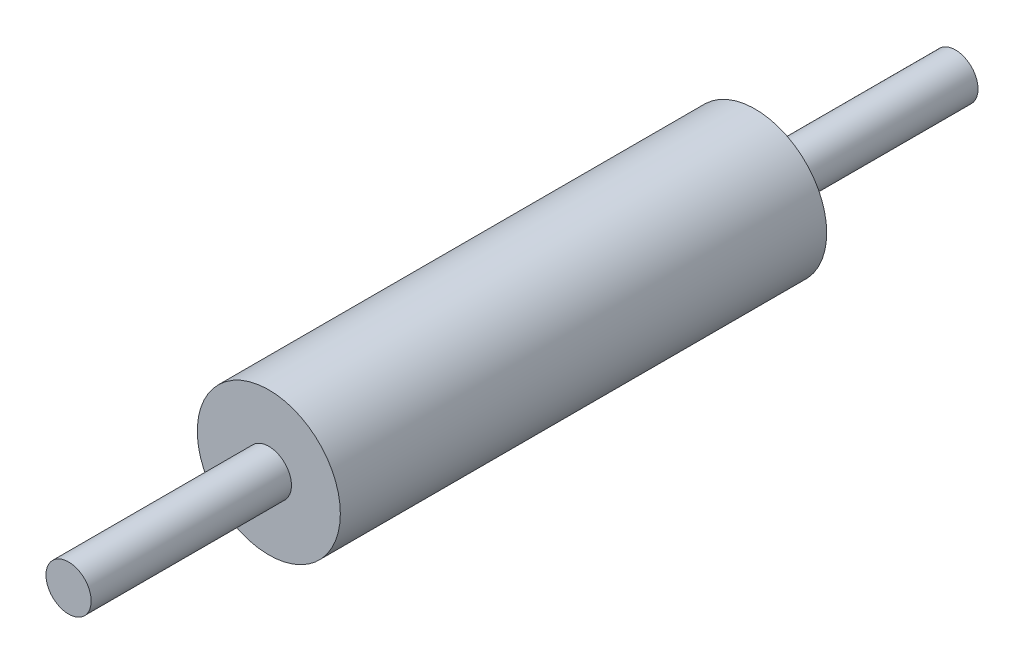
ISO-10303-21;
HEADER;
FILE_DESCRIPTION(('STEP AP214'),'2;1');
FILE_NAME('part.step','',(''),(''),'','','');
FILE_SCHEMA(('AUTOMOTIVE_DESIGN { 1 0 10303 214 1 1 1 1 }'));
ENDSEC;
DATA;
#1=APPLICATION_CONTEXT('core data for automotive mechanical design processes');
#2=APPLICATION_PROTOCOL_DEFINITION('international standard','automotive_design',2000,#1);
#3=PRODUCT_CONTEXT('',#1,'mechanical');
#4=PRODUCT('Part','Part','',(#3));
#5=PRODUCT_RELATED_PRODUCT_CATEGORY('part','',(#4));
#6=PRODUCT_DEFINITION_FORMATION('','',#4);
#7=PRODUCT_DEFINITION_CONTEXT('part definition',#1,'design');
#8=PRODUCT_DEFINITION('design','',#6,#7);
#9=PRODUCT_DEFINITION_SHAPE('','',#8);
#10=(LENGTH_UNIT() NAMED_UNIT(*) SI_UNIT(.MILLI.,.METRE.));
#11=(NAMED_UNIT(*) PLANE_ANGLE_UNIT() SI_UNIT($,.RADIAN.));
#12=(NAMED_UNIT(*) SI_UNIT($,.STERADIAN.) SOLID_ANGLE_UNIT());
#13=UNCERTAINTY_MEASURE_WITH_UNIT(LENGTH_MEASURE(1.E-05),#10,'distance_accuracy_value','');
#14=(GEOMETRIC_REPRESENTATION_CONTEXT(3) GLOBAL_UNCERTAINTY_ASSIGNED_CONTEXT((#13)) GLOBAL_UNIT_ASSIGNED_CONTEXT((#10,
#11,#12)) REPRESENTATION_CONTEXT('',''));
#15=CARTESIAN_POINT('',(0.,0.,0.));
#16=DIRECTION('',(0.,0.,1.));
#17=DIRECTION('',(1.,0.,0.));
#18=AXIS2_PLACEMENT_3D('',#15,#16,#17);
#19=CARTESIAN_POINT('',(0.,0.,-85.));
#20=DIRECTION('',(0.,0.,1.));
#21=DIRECTION('',(1.,0.,0.));
#22=AXIS2_PLACEMENT_3D('',#19,#20,#21);
#23=CYLINDRICAL_SURFACE('',#22,12.5);
#24=CARTESIAN_POINT('',(0.,0.,-85.));
#25=DIRECTION('',(0.,0.,1.));
#26=DIRECTION('',(1.,0.,0.));
#27=AXIS2_PLACEMENT_3D('',#24,#25,#26);
#28=CIRCLE('',#27,12.5);
#29=CARTESIAN_POINT('',(12.5,0.,-85.));
#30=VERTEX_POINT('',#29);
#31=EDGE_CURVE('E51',#30,#30,#28,.T.);
#32=ORIENTED_EDGE('',*,*,#31,.T.);
#33=EDGE_LOOP('',(#32));
#34=FACE_BOUND('',#33,.T.);
#35=CARTESIAN_POINT('',(0.,0.,0.));
#36=DIRECTION('',(0.,0.,1.));
#37=DIRECTION('',(1.,0.,0.));
#38=AXIS2_PLACEMENT_3D('',#35,#36,#37);
#39=CIRCLE('',#38,12.5);
#40=CARTESIAN_POINT('',(12.5,0.,0.));
#41=VERTEX_POINT('',#40);
#42=EDGE_CURVE('E45',#41,#41,#39,.T.);
#43=ORIENTED_EDGE('',*,*,#42,.F.);
#44=EDGE_LOOP('',(#43));
#45=FACE_BOUND('',#44,.T.);
#46=ADVANCED_FACE('F39',(#34,#45),#23,.T.);
#47=CARTESIAN_POINT('',(0.,0.,-85.));
#48=DIRECTION('',(0.,0.,1.));
#49=DIRECTION('',(1.,0.,0.));
#50=AXIS2_PLACEMENT_3D('',#47,#48,#49);
#51=PLANE('',#50);
#52=CARTESIAN_POINT('',(0.,0.,-85.));
#53=DIRECTION('',(0.,0.,-1.));
#54=DIRECTION('',(-1.,0.,0.));
#55=AXIS2_PLACEMENT_3D('',#52,#53,#54);
#56=CIRCLE('',#55,3.95);
#57=CARTESIAN_POINT('',(-3.95,0.,-85.));
#58=VERTEX_POINT('',#57);
#59=EDGE_CURVE('E10',#58,#58,#56,.T.);
#60=ORIENTED_EDGE('',*,*,#59,.F.);
#61=EDGE_LOOP('',(#60));
#62=FACE_BOUND('',#61,.T.);
#63=ORIENTED_EDGE('',*,*,#31,.F.);
#64=EDGE_LOOP('',(#63));
#65=FACE_BOUND('',#64,.T.);
#66=ADVANCED_FACE('F70',(#62,#65),#51,.F.);
#67=CARTESIAN_POINT('',(0.,0.,0.));
#68=DIRECTION('',(0.,0.,1.));
#69=DIRECTION('',(1.,0.,0.));
#70=AXIS2_PLACEMENT_3D('',#67,#68,#69);
#71=PLANE('',#70);
#72=CARTESIAN_POINT('',(0.,0.,0.));
#73=DIRECTION('',(0.,0.,1.));
#74=DIRECTION('',(1.,0.,0.));
#75=AXIS2_PLACEMENT_3D('',#72,#73,#74);
#76=CIRCLE('',#75,3.95);
#77=CARTESIAN_POINT('',(3.95,0.,0.));
#78=VERTEX_POINT('',#77);
#79=EDGE_CURVE('E46',#78,#78,#76,.T.);
#80=ORIENTED_EDGE('',*,*,#79,.F.);
#81=EDGE_LOOP('',(#80));
#82=FACE_BOUND('',#81,.T.);
#83=ORIENTED_EDGE('',*,*,#42,.T.);
#84=EDGE_LOOP('',(#83));
#85=FACE_BOUND('',#84,.T.);
#86=ADVANCED_FACE('F63',(#82,#85),#71,.T.);
#87=CARTESIAN_POINT('',(0.,0.,35.));
#88=DIRECTION('',(0.,0.,-1.));
#89=DIRECTION('',(-1.,0.,0.));
#90=AXIS2_PLACEMENT_3D('',#87,#88,#89);
#91=CYLINDRICAL_SURFACE('',#90,3.95);
#92=CARTESIAN_POINT('',(0.,0.,35.));
#93=DIRECTION('',(0.,0.,1.));
#94=DIRECTION('',(1.,0.,0.));
#95=AXIS2_PLACEMENT_3D('',#92,#93,#94);
#96=CIRCLE('',#95,3.95);
#97=CARTESIAN_POINT('',(3.95,0.,35.));
#98=VERTEX_POINT('',#97);
#99=EDGE_CURVE('E57',#98,#98,#96,.T.);
#100=ORIENTED_EDGE('',*,*,#99,.F.);
#101=EDGE_LOOP('',(#100));
#102=FACE_BOUND('',#101,.T.);
#103=ORIENTED_EDGE('',*,*,#79,.T.);
#104=EDGE_LOOP('',(#103));
#105=FACE_BOUND('',#104,.T.);
#106=ADVANCED_FACE('F77',(#102,#105),#91,.T.);
#107=CARTESIAN_POINT('',(0.,0.,35.));
#108=DIRECTION('',(0.,0.,1.));
#109=DIRECTION('',(1.,0.,0.));
#110=AXIS2_PLACEMENT_3D('',#107,#108,#109);
#111=PLANE('',#110);
#112=ORIENTED_EDGE('',*,*,#99,.T.);
#113=EDGE_LOOP('',(#112));
#114=FACE_BOUND('',#113,.T.);
#115=ADVANCED_FACE('F82',(#114),#111,.T.);
#116=CARTESIAN_POINT('',(0.,0.,-120.));
#117=DIRECTION('',(0.,0.,1.));
#118=DIRECTION('',(1.,0.,0.));
#119=AXIS2_PLACEMENT_3D('',#116,#117,#118);
#120=CYLINDRICAL_SURFACE('',#119,3.95);
#121=CARTESIAN_POINT('',(0.,0.,-120.));
#122=DIRECTION('',(0.,0.,-1.));
#123=DIRECTION('',(-1.,0.,0.));
#124=AXIS2_PLACEMENT_3D('',#121,#122,#123);
#125=CIRCLE('',#124,3.95);
#126=CARTESIAN_POINT('',(-3.95,0.,-120.));
#127=VERTEX_POINT('',#126);
#128=EDGE_CURVE('E54',#127,#127,#125,.T.);
#129=ORIENTED_EDGE('',*,*,#128,.F.);
#130=EDGE_LOOP('',(#129));
#131=FACE_BOUND('',#130,.T.);
#132=ORIENTED_EDGE('',*,*,#59,.T.);
#133=EDGE_LOOP('',(#132));
#134=FACE_BOUND('',#133,.T.);
#135=ADVANCED_FACE('F87',(#131,#134),#120,.T.);
#136=CARTESIAN_POINT('',(0.,0.,-120.));
#137=DIRECTION('',(0.,0.,-1.));
#138=DIRECTION('',(-1.,0.,0.));
#139=AXIS2_PLACEMENT_3D('',#136,#137,#138);
#140=PLANE('',#139);
#141=ORIENTED_EDGE('',*,*,#128,.T.);
#142=EDGE_LOOP('',(#141));
#143=FACE_BOUND('',#142,.T.);
#144=ADVANCED_FACE('F89',(#143),#140,.T.);
#145=CLOSED_SHELL('',(#46,#66,#86,#106,#115,#135,#144));
#146=MANIFOLD_SOLID_BREP('B2',#145);
#147=ADVANCED_BREP_SHAPE_REPRESENTATION('',(#18,#146),#14);
#148=SHAPE_DEFINITION_REPRESENTATION(#9,#147);
ENDSEC;
END-ISO-10303-21;
